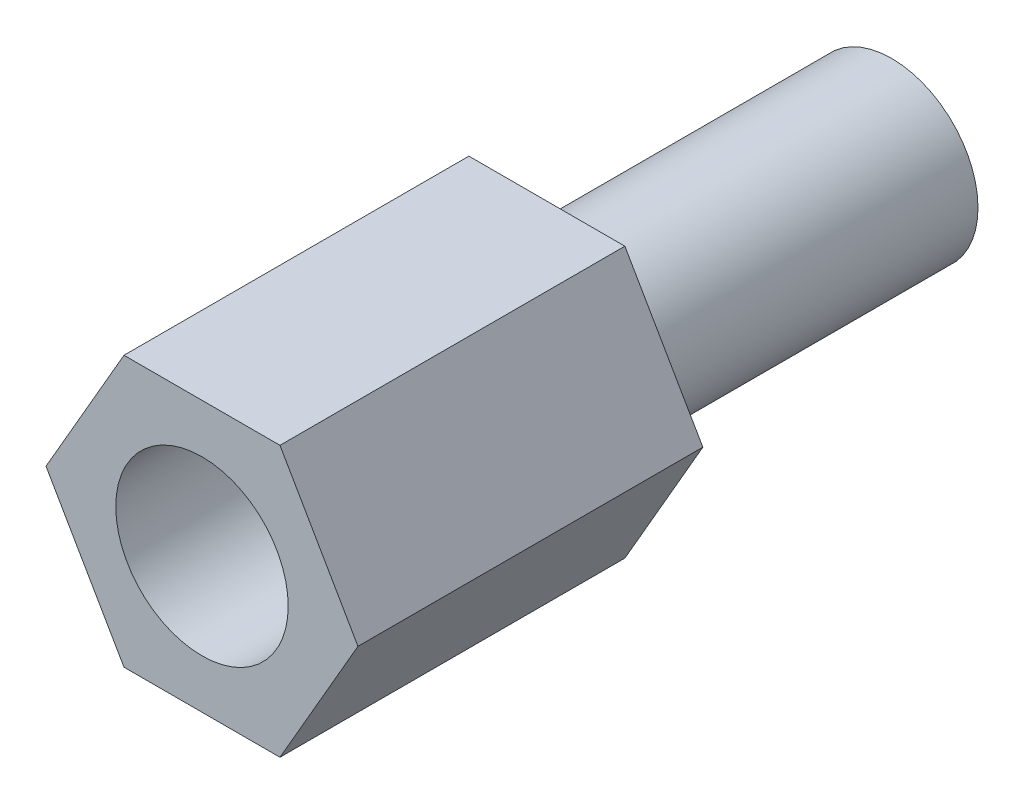
ISO-10303-21;
HEADER;
FILE_DESCRIPTION(('STEP AP214'),'2;1');
FILE_NAME('part.step','',(''),(''),'','','');
FILE_SCHEMA(('AUTOMOTIVE_DESIGN { 1 0 10303 214 1 1 1 1 }'));
ENDSEC;
DATA;
#1=APPLICATION_CONTEXT('core data for automotive mechanical design processes');
#2=APPLICATION_PROTOCOL_DEFINITION('international standard','automotive_design',2000,#1);
#3=PRODUCT_CONTEXT('',#1,'mechanical');
#4=PRODUCT('Part','Part','',(#3));
#5=PRODUCT_RELATED_PRODUCT_CATEGORY('part','',(#4));
#6=PRODUCT_DEFINITION_FORMATION('','',#4);
#7=PRODUCT_DEFINITION_CONTEXT('part definition',#1,'design');
#8=PRODUCT_DEFINITION('design','',#6,#7);
#9=PRODUCT_DEFINITION_SHAPE('','',#8);
#10=(LENGTH_UNIT() NAMED_UNIT(*) SI_UNIT(.MILLI.,.METRE.));
#11=(NAMED_UNIT(*) PLANE_ANGLE_UNIT() SI_UNIT($,.RADIAN.));
#12=(NAMED_UNIT(*) SI_UNIT($,.STERADIAN.) SOLID_ANGLE_UNIT());
#13=UNCERTAINTY_MEASURE_WITH_UNIT(LENGTH_MEASURE(1.E-05),#10,'distance_accuracy_value','');
#14=(GEOMETRIC_REPRESENTATION_CONTEXT(3) GLOBAL_UNCERTAINTY_ASSIGNED_CONTEXT((#13)) GLOBAL_UNIT_ASSIGNED_CONTEXT((#10,
#11,#12)) REPRESENTATION_CONTEXT('',''));
#15=CARTESIAN_POINT('',(0.,0.,0.));
#16=DIRECTION('',(0.,0.,1.));
#17=DIRECTION('',(1.,0.,0.));
#18=AXIS2_PLACEMENT_3D('',#15,#16,#17);
#19=CARTESIAN_POINT('',(1.35677313259565,-2.34999999999999,-6.));
#20=DIRECTION('',(0.866025403784441,-0.499999999999995,0.));
#21=DIRECTION('',(0.499999999999995,0.866025403784442,0.));
#22=AXIS2_PLACEMENT_3D('',#19,#20,#21);
#23=PLANE('',#22);
#24=DIRECTION('',(0.499999999999995,0.866025403784441,0.));
#25=VECTOR('',#24,1.);
#26=CARTESIAN_POINT('',(1.35677313259565,-2.34999999999999,0.));
#27=LINE('',#26,#25);
#28=CARTESIAN_POINT('',(1.35677313259565,-2.34999999999999,0.));
#29=VERTEX_POINT('',#28);
#30=CARTESIAN_POINT('',(2.71354626519124,0.,0.));
#31=VERTEX_POINT('',#30);
#32=EDGE_CURVE('E121',#29,#31,#27,.T.);
#33=ORIENTED_EDGE('',*,*,#32,.F.);
#34=DIRECTION('',(0.,0.,1.));
#35=VECTOR('',#34,1.);
#36=CARTESIAN_POINT('',(1.35677313259565,-2.34999999999999,-6.));
#37=LINE('',#36,#35);
#38=CARTESIAN_POINT('',(1.35677313259565,-2.34999999999999,-6.));
#39=VERTEX_POINT('',#38);
#40=EDGE_CURVE('E43',#39,#29,#37,.T.);
#41=ORIENTED_EDGE('',*,*,#40,.F.);
#42=DIRECTION('',(0.499999999999995,0.866025403784441,0.));
#43=VECTOR('',#42,1.);
#44=CARTESIAN_POINT('',(1.35677313259565,-2.34999999999999,-6.));
#45=LINE('',#44,#43);
#46=CARTESIAN_POINT('',(2.71354626519124,0.,-6.));
#47=VERTEX_POINT('',#46);
#48=EDGE_CURVE('E137',#39,#47,#45,.T.);
#49=ORIENTED_EDGE('',*,*,#48,.T.);
#50=DIRECTION('',(0.,0.,1.));
#51=VECTOR('',#50,1.);
#52=CARTESIAN_POINT('',(2.71354626519124,0.,-6.));
#53=LINE('',#52,#51);
#54=EDGE_CURVE('E37',#47,#31,#53,.T.);
#55=ORIENTED_EDGE('',*,*,#54,.T.);
#56=EDGE_LOOP('',(#33,#41,#49,#55));
#57=FACE_BOUND('',#56,.T.);
#58=ADVANCED_FACE('F34',(#57),#23,.T.);
#59=CARTESIAN_POINT('',(-1.3567731325956,-2.35000000000001,-6.));
#60=DIRECTION('',(0.,-1.,0.));
#61=DIRECTION('',(1.,0.,0.));
#62=AXIS2_PLACEMENT_3D('',#59,#60,#61);
#63=PLANE('',#62);
#64=DIRECTION('',(1.,0.,0.));
#65=VECTOR('',#64,1.);
#66=CARTESIAN_POINT('',(-1.3567731325956,-2.35000000000001,0.));
#67=LINE('',#66,#65);
#68=CARTESIAN_POINT('',(-1.3567731325956,-2.35000000000001,0.));
#69=VERTEX_POINT('',#68);
#70=EDGE_CURVE('E134',#69,#29,#67,.T.);
#71=ORIENTED_EDGE('',*,*,#70,.F.);
#72=DIRECTION('',(0.,0.,1.));
#73=VECTOR('',#72,1.);
#74=CARTESIAN_POINT('',(-1.3567731325956,-2.35000000000001,-6.));
#75=LINE('',#74,#73);
#76=CARTESIAN_POINT('',(-1.3567731325956,-2.35000000000001,-6.));
#77=VERTEX_POINT('',#76);
#78=EDGE_CURVE('E74',#77,#69,#75,.T.);
#79=ORIENTED_EDGE('',*,*,#78,.F.);
#80=DIRECTION('',(1.,0.,0.));
#81=VECTOR('',#80,1.);
#82=CARTESIAN_POINT('',(-1.3567731325956,-2.35000000000001,-6.));
#83=LINE('',#82,#81);
#84=EDGE_CURVE('E111',#77,#39,#83,.T.);
#85=ORIENTED_EDGE('',*,*,#84,.T.);
#86=ORIENTED_EDGE('',*,*,#40,.T.);
#87=EDGE_LOOP('',(#71,#79,#85,#86));
#88=FACE_BOUND('',#87,.T.);
#89=ADVANCED_FACE('F145',(#88),#63,.T.);
#90=CARTESIAN_POINT('',(-2.71354626519124,0.,-6.));
#91=DIRECTION('',(-0.866025403784435,-0.500000000000007,0.));
#92=DIRECTION('',(0.500000000000007,-0.866025403784435,0.));
#93=AXIS2_PLACEMENT_3D('',#90,#91,#92);
#94=PLANE('',#93);
#95=DIRECTION('',(0.500000000000007,-0.866025403784435,0.));
#96=VECTOR('',#95,1.);
#97=CARTESIAN_POINT('',(-2.71354626519124,0.,0.));
#98=LINE('',#97,#96);
#99=CARTESIAN_POINT('',(-2.71354626519124,0.,0.));
#100=VERTEX_POINT('',#99);
#101=EDGE_CURVE('E98',#100,#69,#98,.T.);
#102=ORIENTED_EDGE('',*,*,#101,.F.);
#103=DIRECTION('',(0.,0.,1.));
#104=VECTOR('',#103,1.);
#105=CARTESIAN_POINT('',(-2.71354626519124,0.,-6.));
#106=LINE('',#105,#104);
#107=CARTESIAN_POINT('',(-2.71354626519124,0.,-6.));
#108=VERTEX_POINT('',#107);
#109=EDGE_CURVE('E93',#108,#100,#106,.T.);
#110=ORIENTED_EDGE('',*,*,#109,.F.);
#111=DIRECTION('',(0.500000000000007,-0.866025403784435,0.));
#112=VECTOR('',#111,1.);
#113=CARTESIAN_POINT('',(-2.71354626519124,0.,-6.));
#114=LINE('',#113,#112);
#115=EDGE_CURVE('E96',#108,#77,#114,.T.);
#116=ORIENTED_EDGE('',*,*,#115,.T.);
#117=ORIENTED_EDGE('',*,*,#78,.T.);
#118=EDGE_LOOP('',(#102,#110,#116,#117));
#119=FACE_BOUND('',#118,.T.);
#120=ADVANCED_FACE('F95',(#119),#94,.T.);
#121=CARTESIAN_POINT('',(-1.35677313259563,2.35,-6.));
#122=DIRECTION('',(-0.866025403784442,0.499999999999995,0.));
#123=DIRECTION('',(-0.499999999999995,-0.866025403784442,0.));
#124=AXIS2_PLACEMENT_3D('',#121,#122,#123);
#125=PLANE('',#124);
#126=DIRECTION('',(-0.499999999999995,-0.866025403784442,0.));
#127=VECTOR('',#126,1.);
#128=CARTESIAN_POINT('',(-1.35677313259563,2.35,0.));
#129=LINE('',#128,#127);
#130=CARTESIAN_POINT('',(-1.35677313259563,2.35,0.));
#131=VERTEX_POINT('',#130);
#132=EDGE_CURVE('E131',#131,#100,#129,.T.);
#133=ORIENTED_EDGE('',*,*,#132,.F.);
#134=DIRECTION('',(0.,0.,1.));
#135=VECTOR('',#134,1.);
#136=CARTESIAN_POINT('',(-1.35677313259563,2.35,-6.));
#137=LINE('',#136,#135);
#138=CARTESIAN_POINT('',(-1.35677313259563,2.35,-6.));
#139=VERTEX_POINT('',#138);
#140=EDGE_CURVE('E103',#139,#131,#137,.T.);
#141=ORIENTED_EDGE('',*,*,#140,.F.);
#142=DIRECTION('',(-0.499999999999995,-0.866025403784442,0.));
#143=VECTOR('',#142,1.);
#144=CARTESIAN_POINT('',(-1.35677313259563,2.35,-6.));
#145=LINE('',#144,#143);
#146=EDGE_CURVE('E109',#139,#108,#145,.T.);
#147=ORIENTED_EDGE('',*,*,#146,.T.);
#148=ORIENTED_EDGE('',*,*,#109,.T.);
#149=EDGE_LOOP('',(#133,#141,#147,#148));
#150=FACE_BOUND('',#149,.T.);
#151=ADVANCED_FACE('F113',(#150),#125,.T.);
#152=CARTESIAN_POINT('',(1.35677313259562,2.35000000000001,-6.));
#153=DIRECTION('',(0.,1.,0.));
#154=DIRECTION('',(-1.,0.,0.));
#155=AXIS2_PLACEMENT_3D('',#152,#153,#154);
#156=PLANE('',#155);
#157=DIRECTION('',(-1.,0.,0.));
#158=VECTOR('',#157,1.);
#159=CARTESIAN_POINT('',(1.35677313259562,2.35000000000001,0.));
#160=LINE('',#159,#158);
#161=CARTESIAN_POINT('',(1.35677313259562,2.35000000000001,0.));
#162=VERTEX_POINT('',#161);
#163=EDGE_CURVE('E128',#162,#131,#160,.T.);
#164=ORIENTED_EDGE('',*,*,#163,.F.);
#165=DIRECTION('',(0.,0.,1.));
#166=VECTOR('',#165,1.);
#167=CARTESIAN_POINT('',(1.35677313259562,2.35000000000001,-6.));
#168=LINE('',#167,#166);
#169=CARTESIAN_POINT('',(1.35677313259562,2.35000000000001,-6.));
#170=VERTEX_POINT('',#169);
#171=EDGE_CURVE('E140',#170,#162,#168,.T.);
#172=ORIENTED_EDGE('',*,*,#171,.F.);
#173=DIRECTION('',(-1.,0.,0.));
#174=VECTOR('',#173,1.);
#175=CARTESIAN_POINT('',(1.35677313259562,2.35000000000001,-6.));
#176=LINE('',#175,#174);
#177=EDGE_CURVE('E114',#170,#139,#176,.T.);
#178=ORIENTED_EDGE('',*,*,#177,.T.);
#179=ORIENTED_EDGE('',*,*,#140,.T.);
#180=EDGE_LOOP('',(#164,#172,#178,#179));
#181=FACE_BOUND('',#180,.T.);
#182=ADVANCED_FACE('F158',(#181),#156,.T.);
#183=CARTESIAN_POINT('',(2.71354626519124,0.,-6.));
#184=DIRECTION('',(0.866025403784438,0.500000000000001,0.));
#185=DIRECTION('',(-0.500000000000001,0.866025403784438,0.));
#186=AXIS2_PLACEMENT_3D('',#183,#184,#185);
#187=PLANE('',#186);
#188=DIRECTION('',(-0.500000000000001,0.866025403784438,0.));
#189=VECTOR('',#188,1.);
#190=CARTESIAN_POINT('',(2.71354626519124,0.,0.));
#191=LINE('',#190,#189);
#192=EDGE_CURVE('E124',#31,#162,#191,.T.);
#193=ORIENTED_EDGE('',*,*,#192,.F.);
#194=ORIENTED_EDGE('',*,*,#54,.F.);
#195=DIRECTION('',(-0.500000000000001,0.866025403784438,0.));
#196=VECTOR('',#195,1.);
#197=CARTESIAN_POINT('',(2.71354626519124,0.,-6.));
#198=LINE('',#197,#196);
#199=EDGE_CURVE('E116',#47,#170,#198,.T.);
#200=ORIENTED_EDGE('',*,*,#199,.T.);
#201=ORIENTED_EDGE('',*,*,#171,.T.);
#202=EDGE_LOOP('',(#193,#194,#200,#201));
#203=FACE_BOUND('',#202,.T.);
#204=ADVANCED_FACE('F142',(#203),#187,.T.);
#205=CARTESIAN_POINT('',(0.,0.,-6.));
#206=DIRECTION('',(0.,0.,1.));
#207=DIRECTION('',(1.,0.,0.));
#208=AXIS2_PLACEMENT_3D('',#205,#206,#207);
#209=PLANE('',#208);
#210=CARTESIAN_POINT('',(0.,0.,-6.));
#211=DIRECTION('',(0.,0.,-1.));
#212=DIRECTION('',(-1.,0.,0.));
#213=AXIS2_PLACEMENT_3D('',#210,#211,#212);
#214=CIRCLE('',#213,1.5);
#215=CARTESIAN_POINT('',(-1.5,0.,-6.));
#216=VERTEX_POINT('',#215);
#217=EDGE_CURVE('E11',#216,#216,#214,.T.);
#218=ORIENTED_EDGE('',*,*,#217,.F.);
#219=EDGE_LOOP('',(#218));
#220=FACE_BOUND('',#219,.T.);
#221=ORIENTED_EDGE('',*,*,#48,.F.);
#222=ORIENTED_EDGE('',*,*,#84,.F.);
#223=ORIENTED_EDGE('',*,*,#115,.F.);
#224=ORIENTED_EDGE('',*,*,#146,.F.);
#225=ORIENTED_EDGE('',*,*,#177,.F.);
#226=ORIENTED_EDGE('',*,*,#199,.F.);
#227=EDGE_LOOP('',(#221,#222,#223,#224,#225,#226));
#228=FACE_BOUND('',#227,.T.);
#229=ADVANCED_FACE('F107',(#220,#228),#209,.F.);
#230=CARTESIAN_POINT('',(0.,0.,0.));
#231=DIRECTION('',(0.,0.,1.));
#232=DIRECTION('',(1.,0.,0.));
#233=AXIS2_PLACEMENT_3D('',#230,#231,#232);
#234=PLANE('',#233);
#235=CARTESIAN_POINT('',(0.,0.,0.));
#236=DIRECTION('',(0.,0.,1.));
#237=DIRECTION('',(1.,0.,0.));
#238=AXIS2_PLACEMENT_3D('',#235,#236,#237);
#239=CIRCLE('',#238,1.5);
#240=CARTESIAN_POINT('',(1.5,0.,0.));
#241=VERTEX_POINT('',#240);
#242=EDGE_CURVE('E192',#241,#241,#239,.T.);
#243=ORIENTED_EDGE('',*,*,#242,.F.);
#244=EDGE_LOOP('',(#243));
#245=FACE_BOUND('',#244,.T.);
#246=ORIENTED_EDGE('',*,*,#32,.T.);
#247=ORIENTED_EDGE('',*,*,#192,.T.);
#248=ORIENTED_EDGE('',*,*,#163,.T.);
#249=ORIENTED_EDGE('',*,*,#132,.T.);
#250=ORIENTED_EDGE('',*,*,#101,.T.);
#251=ORIENTED_EDGE('',*,*,#70,.T.);
#252=EDGE_LOOP('',(#246,#247,#248,#249,#250,#251));
#253=FACE_BOUND('',#252,.T.);
#254=ADVANCED_FACE('F144',(#245,#253),#234,.T.);
#255=CARTESIAN_POINT('',(0.,0.,-3.));
#256=DIRECTION('',(0.,0.,1.));
#257=DIRECTION('',(1.,0.,0.));
#258=AXIS2_PLACEMENT_3D('',#255,#256,#257);
#259=CYLINDRICAL_SURFACE('',#258,1.5);
#260=CARTESIAN_POINT('',(0.,0.,-3.));
#261=DIRECTION('',(0.,0.,1.));
#262=DIRECTION('',(1.,0.,0.));
#263=AXIS2_PLACEMENT_3D('',#260,#261,#262);
#264=CIRCLE('',#263,1.5);
#265=CARTESIAN_POINT('',(1.5,0.,-3.));
#266=VERTEX_POINT('',#265);
#267=EDGE_CURVE('E125',#266,#266,#264,.T.);
#268=ORIENTED_EDGE('',*,*,#267,.F.);
#269=EDGE_LOOP('',(#268));
#270=FACE_BOUND('',#269,.T.);
#271=ORIENTED_EDGE('',*,*,#242,.T.);
#272=EDGE_LOOP('',(#271));
#273=FACE_BOUND('',#272,.T.);
#274=ADVANCED_FACE('F169',(#270,#273),#259,.F.);
#275=CARTESIAN_POINT('',(0.,0.,-3.));
#276=DIRECTION('',(0.,0.,1.));
#277=DIRECTION('',(1.,0.,0.));
#278=AXIS2_PLACEMENT_3D('',#275,#276,#277);
#279=PLANE('',#278);
#280=ORIENTED_EDGE('',*,*,#267,.T.);
#281=EDGE_LOOP('',(#280));
#282=FACE_BOUND('',#281,.T.);
#283=ADVANCED_FACE('F175',(#282),#279,.T.);
#284=CARTESIAN_POINT('',(0.,0.,-12.));
#285=DIRECTION('',(0.,0.,1.));
#286=DIRECTION('',(1.,0.,0.));
#287=AXIS2_PLACEMENT_3D('',#284,#285,#286);
#288=CYLINDRICAL_SURFACE('',#287,1.5);
#289=CARTESIAN_POINT('',(0.,0.,-12.));
#290=DIRECTION('',(0.,0.,-1.));
#291=DIRECTION('',(-1.,0.,0.));
#292=AXIS2_PLACEMENT_3D('',#289,#290,#291);
#293=CIRCLE('',#292,1.5);
#294=CARTESIAN_POINT('',(-1.5,0.,-12.));
#295=VERTEX_POINT('',#294);
#296=EDGE_CURVE('E191',#295,#295,#293,.T.);
#297=ORIENTED_EDGE('',*,*,#296,.F.);
#298=EDGE_LOOP('',(#297));
#299=FACE_BOUND('',#298,.T.);
#300=ORIENTED_EDGE('',*,*,#217,.T.);
#301=EDGE_LOOP('',(#300));
#302=FACE_BOUND('',#301,.T.);
#303=ADVANCED_FACE('F179',(#299,#302),#288,.T.);
#304=CARTESIAN_POINT('',(0.,0.,-12.));
#305=DIRECTION('',(0.,0.,-1.));
#306=DIRECTION('',(-1.,0.,0.));
#307=AXIS2_PLACEMENT_3D('',#304,#305,#306);
#308=PLANE('',#307);
#309=ORIENTED_EDGE('',*,*,#296,.T.);
#310=EDGE_LOOP('',(#309));
#311=FACE_BOUND('',#310,.T.);
#312=ADVANCED_FACE('F183',(#311),#308,.T.);
#313=CLOSED_SHELL('',(#58,#89,#120,#151,#182,#204,#229,#254,#274,#283,#303,#312));
#314=MANIFOLD_SOLID_BREP('B2',#313);
#315=ADVANCED_BREP_SHAPE_REPRESENTATION('',(#18,#314),#14);
#316=SHAPE_DEFINITION_REPRESENTATION(#9,#315);
ENDSEC;
END-ISO-10303-21;
